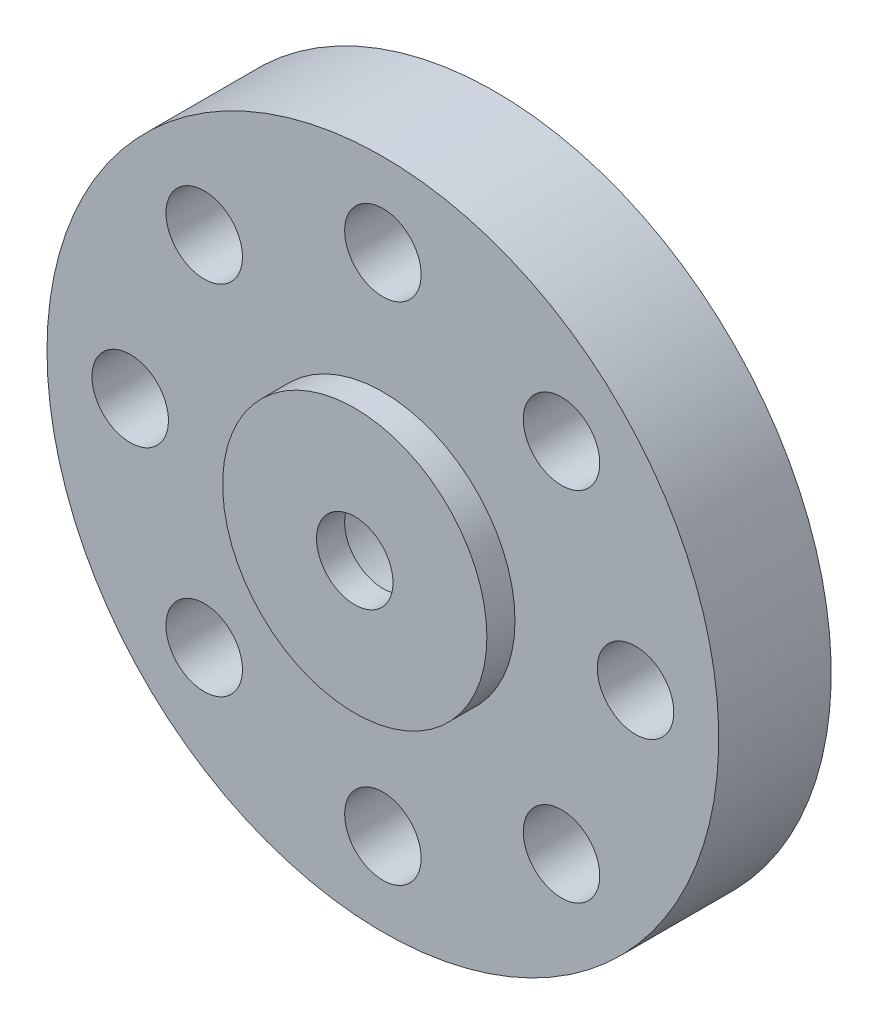
ISO-10303-21;
HEADER;
FILE_DESCRIPTION(('STEP AP214'),'2;1');
FILE_NAME('part.step','',(''),(''),'','','');
FILE_SCHEMA(('AUTOMOTIVE_DESIGN { 1 0 10303 214 1 1 1 1 }'));
ENDSEC;
DATA;
#1=APPLICATION_CONTEXT('core data for automotive mechanical design processes');
#2=APPLICATION_PROTOCOL_DEFINITION('international standard','automotive_design',2000,#1);
#3=PRODUCT_CONTEXT('',#1,'mechanical');
#4=PRODUCT('Part','Part','',(#3));
#5=PRODUCT_RELATED_PRODUCT_CATEGORY('part','',(#4));
#6=PRODUCT_DEFINITION_FORMATION('','',#4);
#7=PRODUCT_DEFINITION_CONTEXT('part definition',#1,'design');
#8=PRODUCT_DEFINITION('design','',#6,#7);
#9=PRODUCT_DEFINITION_SHAPE('','',#8);
#10=(LENGTH_UNIT() NAMED_UNIT(*) SI_UNIT(.MILLI.,.METRE.));
#11=(NAMED_UNIT(*) PLANE_ANGLE_UNIT() SI_UNIT($,.RADIAN.));
#12=(NAMED_UNIT(*) SI_UNIT($,.STERADIAN.) SOLID_ANGLE_UNIT());
#13=UNCERTAINTY_MEASURE_WITH_UNIT(LENGTH_MEASURE(1.E-05),#10,'distance_accuracy_value','');
#14=(GEOMETRIC_REPRESENTATION_CONTEXT(3) GLOBAL_UNCERTAINTY_ASSIGNED_CONTEXT((#13)) GLOBAL_UNIT_ASSIGNED_CONTEXT((#10,
#11,#12)) REPRESENTATION_CONTEXT('',''));
#15=CARTESIAN_POINT('',(0.,0.,0.));
#16=DIRECTION('',(0.,0.,1.));
#17=DIRECTION('',(1.,0.,0.));
#18=AXIS2_PLACEMENT_3D('',#15,#16,#17);
#19=CARTESIAN_POINT('',(19.5,-2.70619806631183E-10,-1.25));
#20=DIRECTION('',(0.,0.,1.));
#21=DIRECTION('',(1.,0.,0.));
#22=AXIS2_PLACEMENT_3D('',#19,#20,#21);
#23=PLANE('',#22);
#24=CARTESIAN_POINT('',(19.5,-2.70619806631183E-10,-1.25));
#25=DIRECTION('',(0.,0.,1.));
#26=DIRECTION('',(1.,0.,0.));
#27=AXIS2_PLACEMENT_3D('',#24,#25,#26);
#28=CIRCLE('',#27,1.7);
#29=CARTESIAN_POINT('',(21.2,-2.70619806631183E-10,-1.25));
#30=VERTEX_POINT('',#29);
#31=EDGE_CURVE('E39',#30,#30,#28,.T.);
#32=ORIENTED_EDGE('',*,*,#31,.T.);
#33=EDGE_LOOP('',(#32));
#34=FACE_BOUND('',#33,.T.);
#35=CARTESIAN_POINT('',(19.5,-2.70619806631183E-10,-1.25));
#36=DIRECTION('',(0.,0.,-1.));
#37=DIRECTION('',(-1.,0.,0.));
#38=AXIS2_PLACEMENT_3D('',#35,#36,#37);
#39=CIRCLE('',#38,3.22000391822367);
#40=CARTESIAN_POINT('',(16.2799960817763,-2.70619806631183E-10,-1.25));
#41=VERTEX_POINT('',#40);
#42=EDGE_CURVE('E63',#41,#41,#39,.T.);
#43=ORIENTED_EDGE('',*,*,#42,.T.);
#44=EDGE_LOOP('',(#43));
#45=FACE_BOUND('',#44,.T.);
#46=ADVANCED_FACE('F32',(#34,#45),#23,.F.);
#47=CARTESIAN_POINT('',(19.5,-2.70619806631183E-10,-1.25));
#48=DIRECTION('',(0.,0.,1.));
#49=DIRECTION('',(1.,0.,0.));
#50=AXIS2_PLACEMENT_3D('',#47,#48,#49);
#51=CYLINDRICAL_SURFACE('',#50,5.875);
#52=CARTESIAN_POINT('',(19.5,-2.70619806631183E-10,-1.25));
#53=DIRECTION('',(0.,0.,1.));
#54=DIRECTION('',(1.,0.,0.));
#55=AXIS2_PLACEMENT_3D('',#52,#53,#54);
#56=CIRCLE('',#55,5.875);
#57=CARTESIAN_POINT('',(25.375,-2.70619806631183E-10,-1.25));
#58=VERTEX_POINT('',#57);
#59=EDGE_CURVE('E48',#58,#58,#56,.T.);
#60=ORIENTED_EDGE('',*,*,#59,.T.);
#61=EDGE_LOOP('',(#60));
#62=FACE_BOUND('',#61,.T.);
#63=CARTESIAN_POINT('',(19.5,-2.70619806631183E-10,0.));
#64=DIRECTION('',(0.,0.,1.));
#65=DIRECTION('',(1.,0.,0.));
#66=AXIS2_PLACEMENT_3D('',#63,#64,#65);
#67=CIRCLE('',#66,5.875);
#68=CARTESIAN_POINT('',(25.375,-2.70619806631183E-10,0.));
#69=VERTEX_POINT('',#68);
#70=EDGE_CURVE('E10',#69,#69,#67,.T.);
#71=ORIENTED_EDGE('',*,*,#70,.F.);
#72=EDGE_LOOP('',(#71));
#73=FACE_BOUND('',#72,.T.);
#74=ADVANCED_FACE('F34',(#62,#73),#51,.T.);
#75=CARTESIAN_POINT('',(19.5,-2.70619806631183E-10,0.));
#76=DIRECTION('',(0.,0.,1.));
#77=DIRECTION('',(1.,0.,0.));
#78=AXIS2_PLACEMENT_3D('',#75,#76,#77);
#79=PLANE('',#78);
#80=CARTESIAN_POINT('',(19.5,-2.70619806631183E-10,0.));
#81=DIRECTION('',(0.,0.,1.));
#82=DIRECTION('',(1.,0.,0.));
#83=AXIS2_PLACEMENT_3D('',#80,#81,#82);
#84=CIRCLE('',#83,1.7);
#85=CARTESIAN_POINT('',(21.2,-2.70619806631183E-10,0.));
#86=VERTEX_POINT('',#85);
#87=EDGE_CURVE('E43',#86,#86,#84,.T.);
#88=ORIENTED_EDGE('',*,*,#87,.F.);
#89=EDGE_LOOP('',(#88));
#90=FACE_BOUND('',#89,.T.);
#91=ORIENTED_EDGE('',*,*,#70,.T.);
#92=EDGE_LOOP('',(#91));
#93=FACE_BOUND('',#92,.T.);
#94=ADVANCED_FACE('F133',(#90,#93),#79,.T.);
#95=CARTESIAN_POINT('',(19.5,-2.70619806631183E-10,-1.25));
#96=DIRECTION('',(0.,0.,1.));
#97=DIRECTION('',(1.,0.,0.));
#98=AXIS2_PLACEMENT_3D('',#95,#96,#97);
#99=CYLINDRICAL_SURFACE('',#98,1.7);
#100=ORIENTED_EDGE('',*,*,#31,.F.);
#101=EDGE_LOOP('',(#100));
#102=FACE_BOUND('',#101,.T.);
#103=ORIENTED_EDGE('',*,*,#87,.T.);
#104=EDGE_LOOP('',(#103));
#105=FACE_BOUND('',#104,.T.);
#106=ADVANCED_FACE('F123',(#102,#105),#99,.F.);
#107=CARTESIAN_POINT('',(19.5,-2.70619806631183E-10,-6.25));
#108=DIRECTION('',(0.,0.,-1.));
#109=DIRECTION('',(-1.,0.,0.));
#110=AXIS2_PLACEMENT_3D('',#107,#108,#109);
#111=PLANE('',#110);
#112=CARTESIAN_POINT('',(8.265,-2.707382928957E-10,-6.25));
#113=DIRECTION('',(0.,0.,-1.));
#114=DIRECTION('',(-1.,0.,0.));
#115=AXIS2_PLACEMENT_3D('',#112,#113,#114);
#116=CIRCLE('',#115,1.7);
#117=CARTESIAN_POINT('',(6.565,-2.707382928957E-10,-6.25));
#118=VERTEX_POINT('',#117);
#119=EDGE_CURVE('E102',#118,#118,#116,.T.);
#120=ORIENTED_EDGE('',*,*,#119,.F.);
#121=EDGE_LOOP('',(#120));
#122=FACE_BOUND('',#121,.T.);
#123=CARTESIAN_POINT('',(19.4999999999999,11.2349999997294,-6.25));
#124=DIRECTION('',(0.,0.,-1.));
#125=DIRECTION('',(-1.,0.,0.));
#126=AXIS2_PLACEMENT_3D('',#123,#124,#125);
#127=CIRCLE('',#126,1.7);
#128=CARTESIAN_POINT('',(17.7999999999999,11.2349999997294,-6.25));
#129=VERTEX_POINT('',#128);
#130=EDGE_CURVE('E90',#129,#129,#127,.T.);
#131=ORIENTED_EDGE('',*,*,#130,.F.);
#132=EDGE_LOOP('',(#131));
#133=FACE_BOUND('',#132,.T.);
#134=CARTESIAN_POINT('',(30.735,-2.70582167782862E-10,-6.25));
#135=DIRECTION('',(0.,0.,-1.));
#136=DIRECTION('',(-1.,0.,0.));
#137=AXIS2_PLACEMENT_3D('',#134,#135,#136);
#138=CIRCLE('',#137,1.7);
#139=CARTESIAN_POINT('',(29.035,-2.70582167782862E-10,-6.25));
#140=VERTEX_POINT('',#139);
#141=EDGE_CURVE('E78',#140,#140,#138,.T.);
#142=ORIENTED_EDGE('',*,*,#141,.F.);
#143=EDGE_LOOP('',(#142));
#144=FACE_BOUND('',#143,.T.);
#145=CARTESIAN_POINT('',(19.5,-11.2350000002706,-6.25));
#146=DIRECTION('',(0.,0.,-1.));
#147=DIRECTION('',(-1.,0.,0.));
#148=AXIS2_PLACEMENT_3D('',#145,#146,#147);
#149=CIRCLE('',#148,1.7);
#150=CARTESIAN_POINT('',(17.8,-11.2350000002706,-6.25));
#151=VERTEX_POINT('',#150);
#152=EDGE_CURVE('E66',#151,#151,#149,.T.);
#153=ORIENTED_EDGE('',*,*,#152,.F.);
#154=EDGE_LOOP('',(#153));
#155=FACE_BOUND('',#154,.T.);
#156=CARTESIAN_POINT('',(19.5,-2.70619806631183E-10,-6.25));
#157=DIRECTION('',(0.,0.,-1.));
#158=DIRECTION('',(-1.,0.,0.));
#159=AXIS2_PLACEMENT_3D('',#156,#157,#158);
#160=CIRCLE('',#159,14.935);
#161=CARTESIAN_POINT('',(4.565,-2.70619806631183E-10,-6.25));
#162=VERTEX_POINT('',#161);
#163=EDGE_CURVE('E54',#162,#162,#160,.T.);
#164=ORIENTED_EDGE('',*,*,#163,.T.);
#165=EDGE_LOOP('',(#164));
#166=FACE_BOUND('',#165,.T.);
#167=CARTESIAN_POINT('',(19.5,-2.70619806631183E-10,-6.25));
#168=DIRECTION('',(0.,0.,-1.));
#169=DIRECTION('',(-1.,0.,0.));
#170=AXIS2_PLACEMENT_3D('',#167,#168,#169);
#171=CIRCLE('',#170,3.22000391822367);
#172=CARTESIAN_POINT('',(16.2799960817763,-2.70619806631183E-10,-6.25));
#173=VERTEX_POINT('',#172);
#174=EDGE_CURVE('E61',#173,#173,#171,.T.);
#175=ORIENTED_EDGE('',*,*,#174,.F.);
#176=EDGE_LOOP('',(#175));
#177=FACE_BOUND('',#176,.T.);
#178=CARTESIAN_POINT('',(27.4443446866309,-7.94434468690147,-6.25));
#179=DIRECTION('',(0.,0.,-1.));
#180=DIRECTION('',(-1.,0.,0.));
#181=AXIS2_PLACEMENT_3D('',#178,#179,#180);
#182=CIRCLE('',#181,1.7);
#183=CARTESIAN_POINT('',(25.7443446866309,-7.94434468690147,-6.25));
#184=VERTEX_POINT('',#183);
#185=EDGE_CURVE('E72',#184,#184,#182,.T.);
#186=ORIENTED_EDGE('',*,*,#185,.F.);
#187=EDGE_LOOP('',(#186));
#188=FACE_BOUND('',#187,.T.);
#189=CARTESIAN_POINT('',(27.4443446866308,7.94434468636028,-6.25));
#190=DIRECTION('',(0.,0.,-1.));
#191=DIRECTION('',(-1.,0.,0.));
#192=AXIS2_PLACEMENT_3D('',#189,#190,#191);
#193=CIRCLE('',#192,1.7);
#194=CARTESIAN_POINT('',(25.7443446866308,7.94434468636028,-6.25));
#195=VERTEX_POINT('',#194);
#196=EDGE_CURVE('E84',#195,#195,#193,.T.);
#197=ORIENTED_EDGE('',*,*,#196,.F.);
#198=EDGE_LOOP('',(#197));
#199=FACE_BOUND('',#198,.T.);
#200=CARTESIAN_POINT('',(11.5556553133691,7.94434468636017,-6.25));
#201=DIRECTION('',(0.,0.,-1.));
#202=DIRECTION('',(-1.,0.,0.));
#203=AXIS2_PLACEMENT_3D('',#200,#201,#202);
#204=CIRCLE('',#203,1.7);
#205=CARTESIAN_POINT('',(9.85565531336907,7.94434468636017,-6.25));
#206=VERTEX_POINT('',#205);
#207=EDGE_CURVE('E96',#206,#206,#204,.T.);
#208=ORIENTED_EDGE('',*,*,#207,.F.);
#209=EDGE_LOOP('',(#208));
#210=FACE_BOUND('',#209,.T.);
#211=CARTESIAN_POINT('',(11.5556553133692,-7.94434468690158,-6.25));
#212=DIRECTION('',(0.,0.,-1.));
#213=DIRECTION('',(-1.,0.,0.));
#214=AXIS2_PLACEMENT_3D('',#211,#212,#213);
#215=CIRCLE('',#214,1.7);
#216=CARTESIAN_POINT('',(9.85565531336924,-7.94434468690158,-6.25));
#217=VERTEX_POINT('',#216);
#218=EDGE_CURVE('E108',#217,#217,#215,.T.);
#219=ORIENTED_EDGE('',*,*,#218,.F.);
#220=EDGE_LOOP('',(#219));
#221=FACE_BOUND('',#220,.T.);
#222=ADVANCED_FACE('F120',(#122,#133,#144,#155,#166,#177,#188,#199,#210,#221),#111,.T.);
#223=CARTESIAN_POINT('',(19.5,-2.70619806631183E-10,-1.25));
#224=DIRECTION('',(0.,0.,-1.));
#225=DIRECTION('',(-1.,0.,0.));
#226=AXIS2_PLACEMENT_3D('',#223,#224,#225);
#227=PLANE('',#226);
#228=ORIENTED_EDGE('',*,*,#59,.F.);
#229=EDGE_LOOP('',(#228));
#230=FACE_BOUND('',#229,.T.);
#231=CARTESIAN_POINT('',(19.5,-2.70619806631183E-10,-1.25));
#232=DIRECTION('',(0.,0.,-1.));
#233=DIRECTION('',(-1.,0.,0.));
#234=AXIS2_PLACEMENT_3D('',#231,#232,#233);
#235=CIRCLE('',#234,14.935);
#236=CARTESIAN_POINT('',(4.565,-2.70619806631183E-10,-1.25));
#237=VERTEX_POINT('',#236);
#238=EDGE_CURVE('E51',#237,#237,#235,.T.);
#239=ORIENTED_EDGE('',*,*,#238,.F.);
#240=EDGE_LOOP('',(#239));
#241=FACE_BOUND('',#240,.T.);
#242=CARTESIAN_POINT('',(19.5,-11.2350000002706,-1.25));
#243=DIRECTION('',(0.,0.,-1.));
#244=DIRECTION('',(-1.,0.,0.));
#245=AXIS2_PLACEMENT_3D('',#242,#243,#244);
#246=CIRCLE('',#245,1.7);
#247=CARTESIAN_POINT('',(17.8,-11.2350000002706,-1.25));
#248=VERTEX_POINT('',#247);
#249=EDGE_CURVE('E69',#248,#248,#246,.T.);
#250=ORIENTED_EDGE('',*,*,#249,.T.);
#251=EDGE_LOOP('',(#250));
#252=FACE_BOUND('',#251,.T.);
#253=CARTESIAN_POINT('',(27.4443446866309,-7.94434468690147,-1.25));
#254=DIRECTION('',(0.,0.,-1.));
#255=DIRECTION('',(-1.,0.,0.));
#256=AXIS2_PLACEMENT_3D('',#253,#254,#255);
#257=CIRCLE('',#256,1.7);
#258=CARTESIAN_POINT('',(25.7443446866309,-7.94434468690147,-1.25));
#259=VERTEX_POINT('',#258);
#260=EDGE_CURVE('E75',#259,#259,#257,.T.);
#261=ORIENTED_EDGE('',*,*,#260,.T.);
#262=EDGE_LOOP('',(#261));
#263=FACE_BOUND('',#262,.T.);
#264=CARTESIAN_POINT('',(30.735,-2.70582167782862E-10,-1.25));
#265=DIRECTION('',(0.,0.,-1.));
#266=DIRECTION('',(-1.,0.,0.));
#267=AXIS2_PLACEMENT_3D('',#264,#265,#266);
#268=CIRCLE('',#267,1.7);
#269=CARTESIAN_POINT('',(29.035,-2.70582167782862E-10,-1.25));
#270=VERTEX_POINT('',#269);
#271=EDGE_CURVE('E81',#270,#270,#268,.T.);
#272=ORIENTED_EDGE('',*,*,#271,.T.);
#273=EDGE_LOOP('',(#272));
#274=FACE_BOUND('',#273,.T.);
#275=CARTESIAN_POINT('',(27.4443446866308,7.94434468636028,-1.25));
#276=DIRECTION('',(0.,0.,-1.));
#277=DIRECTION('',(-1.,0.,0.));
#278=AXIS2_PLACEMENT_3D('',#275,#276,#277);
#279=CIRCLE('',#278,1.7);
#280=CARTESIAN_POINT('',(25.7443446866308,7.94434468636028,-1.25));
#281=VERTEX_POINT('',#280);
#282=EDGE_CURVE('E87',#281,#281,#279,.T.);
#283=ORIENTED_EDGE('',*,*,#282,.T.);
#284=EDGE_LOOP('',(#283));
#285=FACE_BOUND('',#284,.T.);
#286=CARTESIAN_POINT('',(19.4999999999999,11.2349999997294,-1.25));
#287=DIRECTION('',(0.,0.,-1.));
#288=DIRECTION('',(-1.,0.,0.));
#289=AXIS2_PLACEMENT_3D('',#286,#287,#288);
#290=CIRCLE('',#289,1.7);
#291=CARTESIAN_POINT('',(17.7999999999999,11.2349999997294,-1.25));
#292=VERTEX_POINT('',#291);
#293=EDGE_CURVE('E93',#292,#292,#290,.T.);
#294=ORIENTED_EDGE('',*,*,#293,.T.);
#295=EDGE_LOOP('',(#294));
#296=FACE_BOUND('',#295,.T.);
#297=CARTESIAN_POINT('',(11.5556553133691,7.94434468636017,-1.25));
#298=DIRECTION('',(0.,0.,-1.));
#299=DIRECTION('',(-1.,0.,0.));
#300=AXIS2_PLACEMENT_3D('',#297,#298,#299);
#301=CIRCLE('',#300,1.7);
#302=CARTESIAN_POINT('',(9.85565531336907,7.94434468636017,-1.25));
#303=VERTEX_POINT('',#302);
#304=EDGE_CURVE('E99',#303,#303,#301,.T.);
#305=ORIENTED_EDGE('',*,*,#304,.T.);
#306=EDGE_LOOP('',(#305));
#307=FACE_BOUND('',#306,.T.);
#308=CARTESIAN_POINT('',(8.265,-2.707382928957E-10,-1.25));
#309=DIRECTION('',(0.,0.,-1.));
#310=DIRECTION('',(-1.,0.,0.));
#311=AXIS2_PLACEMENT_3D('',#308,#309,#310);
#312=CIRCLE('',#311,1.7);
#313=CARTESIAN_POINT('',(6.565,-2.707382928957E-10,-1.25));
#314=VERTEX_POINT('',#313);
#315=EDGE_CURVE('E105',#314,#314,#312,.T.);
#316=ORIENTED_EDGE('',*,*,#315,.T.);
#317=EDGE_LOOP('',(#316));
#318=FACE_BOUND('',#317,.T.);
#319=CARTESIAN_POINT('',(11.5556553133692,-7.94434468690158,-1.25));
#320=DIRECTION('',(0.,0.,-1.));
#321=DIRECTION('',(-1.,0.,0.));
#322=AXIS2_PLACEMENT_3D('',#319,#320,#321);
#323=CIRCLE('',#322,1.7);
#324=CARTESIAN_POINT('',(9.85565531336924,-7.94434468690158,-1.25));
#325=VERTEX_POINT('',#324);
#326=EDGE_CURVE('E111',#325,#325,#323,.T.);
#327=ORIENTED_EDGE('',*,*,#326,.T.);
#328=EDGE_LOOP('',(#327));
#329=FACE_BOUND('',#328,.T.);
#330=ADVANCED_FACE('F122',(#230,#241,#252,#263,#274,#285,#296,#307,#318,#329),#227,.F.);
#331=CARTESIAN_POINT('',(19.5,-2.70619806631183E-10,-6.25));
#332=DIRECTION('',(0.,0.,1.));
#333=DIRECTION('',(1.,0.,0.));
#334=AXIS2_PLACEMENT_3D('',#331,#332,#333);
#335=CYLINDRICAL_SURFACE('',#334,14.935);
#336=ORIENTED_EDGE('',*,*,#163,.F.);
#337=EDGE_LOOP('',(#336));
#338=FACE_BOUND('',#337,.T.);
#339=ORIENTED_EDGE('',*,*,#238,.T.);
#340=EDGE_LOOP('',(#339));
#341=FACE_BOUND('',#340,.T.);
#342=ADVANCED_FACE('F130',(#338,#341),#335,.T.);
#343=CARTESIAN_POINT('',(19.5,-2.70619806631183E-10,-6.25));
#344=DIRECTION('',(0.,0.,1.));
#345=DIRECTION('',(1.,0.,0.));
#346=AXIS2_PLACEMENT_3D('',#343,#344,#345);
#347=CYLINDRICAL_SURFACE('',#346,3.22000391822367);
#348=ORIENTED_EDGE('',*,*,#174,.T.);
#349=EDGE_LOOP('',(#348));
#350=FACE_BOUND('',#349,.T.);
#351=ORIENTED_EDGE('',*,*,#42,.F.);
#352=EDGE_LOOP('',(#351));
#353=FACE_BOUND('',#352,.T.);
#354=ADVANCED_FACE('F181',(#350,#353),#347,.F.);
#355=CARTESIAN_POINT('',(19.5,-11.2350000002706,-6.25));
#356=DIRECTION('',(0.,0.,1.));
#357=DIRECTION('',(1.,0.,0.));
#358=AXIS2_PLACEMENT_3D('',#355,#356,#357);
#359=CYLINDRICAL_SURFACE('',#358,1.7);
#360=ORIENTED_EDGE('',*,*,#152,.T.);
#361=EDGE_LOOP('',(#360));
#362=FACE_BOUND('',#361,.T.);
#363=ORIENTED_EDGE('',*,*,#249,.F.);
#364=EDGE_LOOP('',(#363));
#365=FACE_BOUND('',#364,.T.);
#366=ADVANCED_FACE('F190',(#362,#365),#359,.F.);
#367=CARTESIAN_POINT('',(27.4443446866309,-7.94434468690147,-6.25));
#368=DIRECTION('',(0.,0.,1.));
#369=DIRECTION('',(1.,0.,0.));
#370=AXIS2_PLACEMENT_3D('',#367,#368,#369);
#371=CYLINDRICAL_SURFACE('',#370,1.7);
#372=ORIENTED_EDGE('',*,*,#185,.T.);
#373=EDGE_LOOP('',(#372));
#374=FACE_BOUND('',#373,.T.);
#375=ORIENTED_EDGE('',*,*,#260,.F.);
#376=EDGE_LOOP('',(#375));
#377=FACE_BOUND('',#376,.T.);
#378=ADVANCED_FACE('F199',(#374,#377),#371,.F.);
#379=CARTESIAN_POINT('',(30.735,-2.70582167782862E-10,-6.25));
#380=DIRECTION('',(0.,0.,1.));
#381=DIRECTION('',(1.,0.,0.));
#382=AXIS2_PLACEMENT_3D('',#379,#380,#381);
#383=CYLINDRICAL_SURFACE('',#382,1.7);
#384=ORIENTED_EDGE('',*,*,#141,.T.);
#385=EDGE_LOOP('',(#384));
#386=FACE_BOUND('',#385,.T.);
#387=ORIENTED_EDGE('',*,*,#271,.F.);
#388=EDGE_LOOP('',(#387));
#389=FACE_BOUND('',#388,.T.);
#390=ADVANCED_FACE('F209',(#386,#389),#383,.F.);
#391=CARTESIAN_POINT('',(27.4443446866308,7.94434468636028,-6.25));
#392=DIRECTION('',(0.,0.,1.));
#393=DIRECTION('',(1.,0.,0.));
#394=AXIS2_PLACEMENT_3D('',#391,#392,#393);
#395=CYLINDRICAL_SURFACE('',#394,1.7);
#396=ORIENTED_EDGE('',*,*,#196,.T.);
#397=EDGE_LOOP('',(#396));
#398=FACE_BOUND('',#397,.T.);
#399=ORIENTED_EDGE('',*,*,#282,.F.);
#400=EDGE_LOOP('',(#399));
#401=FACE_BOUND('',#400,.T.);
#402=ADVANCED_FACE('F219',(#398,#401),#395,.F.);
#403=CARTESIAN_POINT('',(19.4999999999999,11.2349999997294,-6.25));
#404=DIRECTION('',(0.,0.,1.));
#405=DIRECTION('',(1.,0.,0.));
#406=AXIS2_PLACEMENT_3D('',#403,#404,#405);
#407=CYLINDRICAL_SURFACE('',#406,1.7);
#408=ORIENTED_EDGE('',*,*,#130,.T.);
#409=EDGE_LOOP('',(#408));
#410=FACE_BOUND('',#409,.T.);
#411=ORIENTED_EDGE('',*,*,#293,.F.);
#412=EDGE_LOOP('',(#411));
#413=FACE_BOUND('',#412,.T.);
#414=ADVANCED_FACE('F229',(#410,#413),#407,.F.);
#415=CARTESIAN_POINT('',(11.5556553133691,7.94434468636017,-6.25));
#416=DIRECTION('',(0.,0.,1.));
#417=DIRECTION('',(1.,0.,0.));
#418=AXIS2_PLACEMENT_3D('',#415,#416,#417);
#419=CYLINDRICAL_SURFACE('',#418,1.7);
#420=ORIENTED_EDGE('',*,*,#207,.T.);
#421=EDGE_LOOP('',(#420));
#422=FACE_BOUND('',#421,.T.);
#423=ORIENTED_EDGE('',*,*,#304,.F.);
#424=EDGE_LOOP('',(#423));
#425=FACE_BOUND('',#424,.T.);
#426=ADVANCED_FACE('F239',(#422,#425),#419,.F.);
#427=CARTESIAN_POINT('',(8.265,-2.707382928957E-10,-6.25));
#428=DIRECTION('',(0.,0.,1.));
#429=DIRECTION('',(1.,0.,0.));
#430=AXIS2_PLACEMENT_3D('',#427,#428,#429);
#431=CYLINDRICAL_SURFACE('',#430,1.7);
#432=ORIENTED_EDGE('',*,*,#119,.T.);
#433=EDGE_LOOP('',(#432));
#434=FACE_BOUND('',#433,.T.);
#435=ORIENTED_EDGE('',*,*,#315,.F.);
#436=EDGE_LOOP('',(#435));
#437=FACE_BOUND('',#436,.T.);
#438=ADVANCED_FACE('F249',(#434,#437),#431,.F.);
#439=CARTESIAN_POINT('',(11.5556553133692,-7.94434468690158,-6.25));
#440=DIRECTION('',(0.,0.,1.));
#441=DIRECTION('',(1.,0.,0.));
#442=AXIS2_PLACEMENT_3D('',#439,#440,#441);
#443=CYLINDRICAL_SURFACE('',#442,1.7);
#444=ORIENTED_EDGE('',*,*,#218,.T.);
#445=EDGE_LOOP('',(#444));
#446=FACE_BOUND('',#445,.T.);
#447=ORIENTED_EDGE('',*,*,#326,.F.);
#448=EDGE_LOOP('',(#447));
#449=FACE_BOUND('',#448,.T.);
#450=ADVANCED_FACE('F117',(#446,#449),#443,.F.);
#451=CLOSED_SHELL('',(#46,#74,#94,#106,#222,#330,#342,#354,#366,#378,#390,#402,#414,#426,#438,#450));
#452=MANIFOLD_SOLID_BREP('B2',#451);
#453=ADVANCED_BREP_SHAPE_REPRESENTATION('',(#18,#452),#14);
#454=SHAPE_DEFINITION_REPRESENTATION(#9,#453);
ENDSEC;
END-ISO-10303-21;
